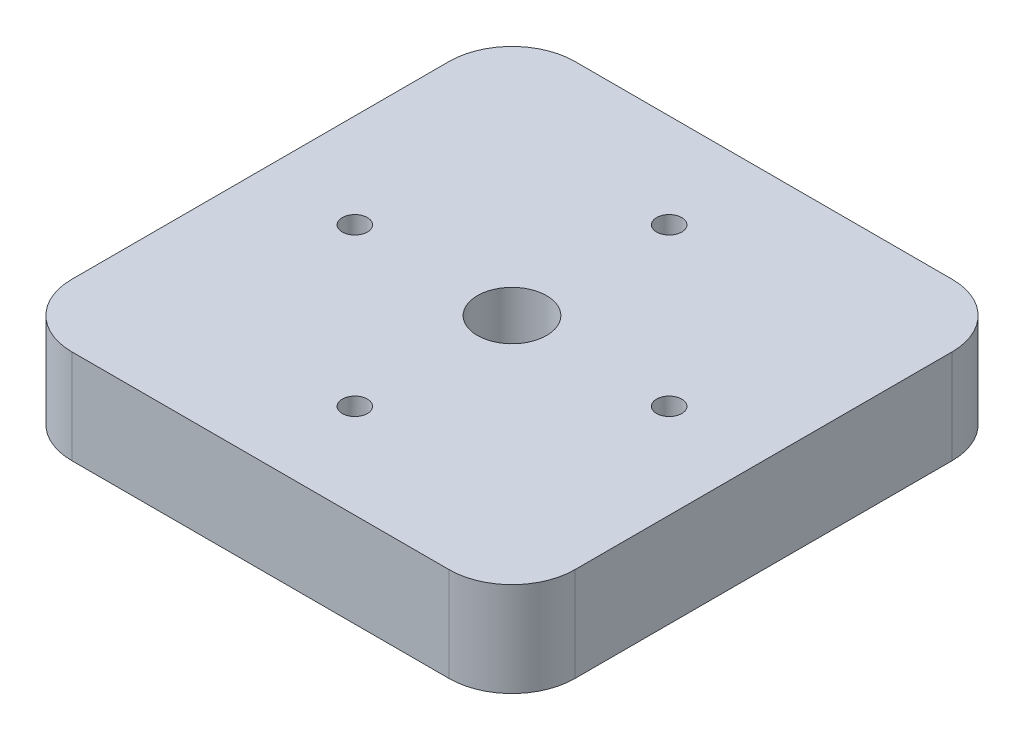
ISO-10303-21;
HEADER;
FILE_DESCRIPTION(('STEP AP214'),'2;1');
FILE_NAME('part.step','',(''),(''),'','','');
FILE_SCHEMA(('AUTOMOTIVE_DESIGN { 1 0 10303 214 1 1 1 1 }'));
ENDSEC;
DATA;
#1=APPLICATION_CONTEXT('core data for automotive mechanical design processes');
#2=APPLICATION_PROTOCOL_DEFINITION('international standard','automotive_design',2000,#1);
#3=PRODUCT_CONTEXT('',#1,'mechanical');
#4=PRODUCT('Part','Part','',(#3));
#5=PRODUCT_RELATED_PRODUCT_CATEGORY('part','',(#4));
#6=PRODUCT_DEFINITION_FORMATION('','',#4);
#7=PRODUCT_DEFINITION_CONTEXT('part definition',#1,'design');
#8=PRODUCT_DEFINITION('design','',#6,#7);
#9=PRODUCT_DEFINITION_SHAPE('','',#8);
#10=(LENGTH_UNIT() NAMED_UNIT(*) SI_UNIT(.MILLI.,.METRE.));
#11=(NAMED_UNIT(*) PLANE_ANGLE_UNIT() SI_UNIT($,.RADIAN.));
#12=(NAMED_UNIT(*) SI_UNIT($,.STERADIAN.) SOLID_ANGLE_UNIT());
#13=UNCERTAINTY_MEASURE_WITH_UNIT(LENGTH_MEASURE(1.E-05),#10,'distance_accuracy_value','');
#14=(GEOMETRIC_REPRESENTATION_CONTEXT(3) GLOBAL_UNCERTAINTY_ASSIGNED_CONTEXT((#13)) GLOBAL_UNIT_ASSIGNED_CONTEXT((#10,
#11,#12)) REPRESENTATION_CONTEXT('',''));
#15=CARTESIAN_POINT('',(0.,0.,0.));
#16=DIRECTION('',(0.,0.,1.));
#17=DIRECTION('',(1.,0.,0.));
#18=AXIS2_PLACEMENT_3D('',#15,#16,#17);
#19=CARTESIAN_POINT('',(0.,15.,0.));
#20=DIRECTION('',(0.,-1.,0.));
#21=DIRECTION('',(0.,0.,-1.));
#22=AXIS2_PLACEMENT_3D('',#19,#20,#21);
#23=CYLINDRICAL_SURFACE('',#22,7.);
#24=CARTESIAN_POINT('',(0.,0.,0.));
#25=DIRECTION('',(0.,1.,0.));
#26=DIRECTION('',(0.,0.,1.));
#27=AXIS2_PLACEMENT_3D('',#24,#25,#26);
#28=CIRCLE('',#27,7.);
#29=CARTESIAN_POINT('',(0.,0.,7.00000000000001));
#30=VERTEX_POINT('',#29);
#31=EDGE_CURVE('E147',#30,#30,#28,.T.);
#32=ORIENTED_EDGE('',*,*,#31,.F.);
#33=EDGE_LOOP('',(#32));
#34=FACE_BOUND('',#33,.T.);
#35=CARTESIAN_POINT('',(0.,7.,0.));
#36=DIRECTION('',(0.,1.,0.));
#37=DIRECTION('',(0.,0.,1.));
#38=AXIS2_PLACEMENT_3D('',#35,#36,#37);
#39=CIRCLE('',#38,7.);
#40=CARTESIAN_POINT('',(0.,7.,7.00000000000001));
#41=VERTEX_POINT('',#40);
#42=EDGE_CURVE('E242',#41,#41,#39,.T.);
#43=ORIENTED_EDGE('',*,*,#42,.T.);
#44=EDGE_LOOP('',(#43));
#45=FACE_BOUND('',#44,.T.);
#46=ADVANCED_FACE('F39',(#34,#45),#23,.F.);
#47=CARTESIAN_POINT('',(-30.,15.,30.));
#48=DIRECTION('',(0.,1.,0.));
#49=DIRECTION('',(0.,0.,1.));
#50=AXIS2_PLACEMENT_3D('',#47,#48,#49);
#51=PLANE('',#50);
#52=CARTESIAN_POINT('',(-25.,15.,0.));
#53=DIRECTION('',(0.,1.,0.));
#54=DIRECTION('',(0.,0.,1.));
#55=AXIS2_PLACEMENT_3D('',#52,#53,#54);
#56=CIRCLE('',#55,2.);
#57=CARTESIAN_POINT('',(-25.,15.,2.));
#58=VERTEX_POINT('',#57);
#59=EDGE_CURVE('E226',#58,#58,#56,.T.);
#60=ORIENTED_EDGE('',*,*,#59,.F.);
#61=EDGE_LOOP('',(#60));
#62=FACE_BOUND('',#61,.T.);
#63=CARTESIAN_POINT('',(0.,15.,-25.));
#64=DIRECTION('',(0.,1.,0.));
#65=DIRECTION('',(0.,0.,1.));
#66=AXIS2_PLACEMENT_3D('',#63,#64,#65);
#67=CIRCLE('',#66,2.);
#68=CARTESIAN_POINT('',(0.,15.,-23.));
#69=VERTEX_POINT('',#68);
#70=EDGE_CURVE('E213',#69,#69,#67,.T.);
#71=ORIENTED_EDGE('',*,*,#70,.F.);
#72=EDGE_LOOP('',(#71));
#73=FACE_BOUND('',#72,.T.);
#74=CARTESIAN_POINT('',(-30.,15.,30.));
#75=DIRECTION('',(0.,1.,0.));
#76=DIRECTION('',(0.,0.,1.));
#77=AXIS2_PLACEMENT_3D('',#74,#75,#76);
#78=CIRCLE('',#77,10.);
#79=CARTESIAN_POINT('',(-40.,15.,29.9999999999999));
#80=VERTEX_POINT('',#79);
#81=CARTESIAN_POINT('',(-29.9999999999999,15.,40.));
#82=VERTEX_POINT('',#81);
#83=EDGE_CURVE('E165',#80,#82,#78,.T.);
#84=ORIENTED_EDGE('',*,*,#83,.T.);
#85=DIRECTION('',(1.,0.,0.));
#86=VECTOR('',#85,1.);
#87=CARTESIAN_POINT('',(-29.9999999999999,15.,40.));
#88=LINE('',#87,#86);
#89=CARTESIAN_POINT('',(29.9999999999999,15.,40.));
#90=VERTEX_POINT('',#89);
#91=EDGE_CURVE('E100',#82,#90,#88,.T.);
#92=ORIENTED_EDGE('',*,*,#91,.T.);
#93=CARTESIAN_POINT('',(30.,15.,30.));
#94=DIRECTION('',(0.,1.,0.));
#95=DIRECTION('',(0.,0.,1.));
#96=AXIS2_PLACEMENT_3D('',#93,#94,#95);
#97=CIRCLE('',#96,10.);
#98=CARTESIAN_POINT('',(40.,15.,29.9999999999999));
#99=VERTEX_POINT('',#98);
#100=EDGE_CURVE('E186',#90,#99,#97,.T.);
#101=ORIENTED_EDGE('',*,*,#100,.T.);
#102=DIRECTION('',(0.,0.,-1.));
#103=VECTOR('',#102,1.);
#104=CARTESIAN_POINT('',(40.,15.,-29.9999999999999));
#105=LINE('',#104,#103);
#106=CARTESIAN_POINT('',(40.,15.,-29.9999999999999));
#107=VERTEX_POINT('',#106);
#108=EDGE_CURVE('E200',#99,#107,#105,.T.);
#109=ORIENTED_EDGE('',*,*,#108,.T.);
#110=CARTESIAN_POINT('',(30.,15.,-30.));
#111=DIRECTION('',(0.,1.,0.));
#112=DIRECTION('',(0.,0.,-1.));
#113=AXIS2_PLACEMENT_3D('',#110,#111,#112);
#114=CIRCLE('',#113,10.);
#115=CARTESIAN_POINT('',(29.9999999999999,15.,-40.));
#116=VERTEX_POINT('',#115);
#117=EDGE_CURVE('E120',#107,#116,#114,.T.);
#118=ORIENTED_EDGE('',*,*,#117,.T.);
#119=DIRECTION('',(-1.,0.,0.));
#120=VECTOR('',#119,1.);
#121=CARTESIAN_POINT('',(-29.9999999999999,15.,-40.));
#122=LINE('',#121,#120);
#123=CARTESIAN_POINT('',(-29.9999999999999,15.,-40.));
#124=VERTEX_POINT('',#123);
#125=EDGE_CURVE('E113',#116,#124,#122,.T.);
#126=ORIENTED_EDGE('',*,*,#125,.T.);
#127=CARTESIAN_POINT('',(-30.,15.,-30.));
#128=DIRECTION('',(0.,1.,0.));
#129=DIRECTION('',(0.,0.,1.));
#130=AXIS2_PLACEMENT_3D('',#127,#128,#129);
#131=CIRCLE('',#130,10.);
#132=CARTESIAN_POINT('',(-40.,15.,-29.9999999999999));
#133=VERTEX_POINT('',#132);
#134=EDGE_CURVE('E118',#124,#133,#131,.T.);
#135=ORIENTED_EDGE('',*,*,#134,.T.);
#136=DIRECTION('',(0.,0.,1.));
#137=VECTOR('',#136,1.);
#138=CARTESIAN_POINT('',(-40.,15.,-29.9999999999999));
#139=LINE('',#138,#137);
#140=EDGE_CURVE('E57',#133,#80,#139,.T.);
#141=ORIENTED_EDGE('',*,*,#140,.T.);
#142=EDGE_LOOP('',(#84,#92,#101,#109,#118,#126,#135,#141));
#143=FACE_BOUND('',#142,.T.);
#144=CARTESIAN_POINT('',(0.,15.,25.));
#145=DIRECTION('',(0.,1.,0.));
#146=DIRECTION('',(0.,0.,1.));
#147=AXIS2_PLACEMENT_3D('',#144,#145,#146);
#148=CIRCLE('',#147,2.);
#149=CARTESIAN_POINT('',(0.,15.,27.));
#150=VERTEX_POINT('',#149);
#151=EDGE_CURVE('E218',#150,#150,#148,.T.);
#152=ORIENTED_EDGE('',*,*,#151,.F.);
#153=EDGE_LOOP('',(#152));
#154=FACE_BOUND('',#153,.T.);
#155=CARTESIAN_POINT('',(25.,15.,0.));
#156=DIRECTION('',(0.,1.,0.));
#157=DIRECTION('',(0.,0.,1.));
#158=AXIS2_PLACEMENT_3D('',#155,#156,#157);
#159=CIRCLE('',#158,2.);
#160=CARTESIAN_POINT('',(25.,15.,2.00000000000001));
#161=VERTEX_POINT('',#160);
#162=EDGE_CURVE('E234',#161,#161,#159,.T.);
#163=ORIENTED_EDGE('',*,*,#162,.F.);
#164=EDGE_LOOP('',(#163));
#165=FACE_BOUND('',#164,.T.);
#166=CARTESIAN_POINT('',(0.,15.,0.));
#167=DIRECTION('',(0.,1.,0.));
#168=DIRECTION('',(0.,0.,1.));
#169=AXIS2_PLACEMENT_3D('',#166,#167,#168);
#170=CIRCLE('',#169,5.5);
#171=CARTESIAN_POINT('',(0.,15.,5.50000000000001));
#172=VERTEX_POINT('',#171);
#173=EDGE_CURVE('E250',#172,#172,#170,.T.);
#174=ORIENTED_EDGE('',*,*,#173,.F.);
#175=EDGE_LOOP('',(#174));
#176=FACE_BOUND('',#175,.T.);
#177=ADVANCED_FACE('F115',(#62,#73,#143,#154,#165,#176),#51,.T.);
#178=CARTESIAN_POINT('',(-30.,0.,30.));
#179=DIRECTION('',(0.,1.,0.));
#180=DIRECTION('',(0.,0.,1.));
#181=AXIS2_PLACEMENT_3D('',#178,#179,#180);
#182=PLANE('',#181);
#183=CARTESIAN_POINT('',(-30.,0.,30.));
#184=DIRECTION('',(0.,1.,0.));
#185=DIRECTION('',(0.,0.,1.));
#186=AXIS2_PLACEMENT_3D('',#183,#184,#185);
#187=CIRCLE('',#186,10.);
#188=CARTESIAN_POINT('',(-40.,0.,29.9999999999999));
#189=VERTEX_POINT('',#188);
#190=CARTESIAN_POINT('',(-29.9999999999999,0.,40.));
#191=VERTEX_POINT('',#190);
#192=EDGE_CURVE('E142',#189,#191,#187,.T.);
#193=ORIENTED_EDGE('',*,*,#192,.F.);
#194=DIRECTION('',(0.,0.,1.));
#195=VECTOR('',#194,1.);
#196=CARTESIAN_POINT('',(-40.,0.,-29.9999999999999));
#197=LINE('',#196,#195);
#198=CARTESIAN_POINT('',(-40.,0.,-29.9999999999999));
#199=VERTEX_POINT('',#198);
#200=EDGE_CURVE('E92',#199,#189,#197,.T.);
#201=ORIENTED_EDGE('',*,*,#200,.F.);
#202=CARTESIAN_POINT('',(-30.,0.,-30.));
#203=DIRECTION('',(0.,1.,0.));
#204=DIRECTION('',(0.,0.,1.));
#205=AXIS2_PLACEMENT_3D('',#202,#203,#204);
#206=CIRCLE('',#205,10.);
#207=CARTESIAN_POINT('',(-29.9999999999999,0.,-40.));
#208=VERTEX_POINT('',#207);
#209=EDGE_CURVE('E86',#208,#199,#206,.T.);
#210=ORIENTED_EDGE('',*,*,#209,.F.);
#211=DIRECTION('',(-1.,0.,0.));
#212=VECTOR('',#211,1.);
#213=CARTESIAN_POINT('',(-29.9999999999999,0.,-40.));
#214=LINE('',#213,#212);
#215=CARTESIAN_POINT('',(29.9999999999999,0.,-40.));
#216=VERTEX_POINT('',#215);
#217=EDGE_CURVE('E129',#216,#208,#214,.T.);
#218=ORIENTED_EDGE('',*,*,#217,.F.);
#219=CARTESIAN_POINT('',(30.,0.,-30.));
#220=DIRECTION('',(0.,1.,0.));
#221=DIRECTION('',(0.,0.,-1.));
#222=AXIS2_PLACEMENT_3D('',#219,#220,#221);
#223=CIRCLE('',#222,10.);
#224=CARTESIAN_POINT('',(40.,0.,-29.9999999999999));
#225=VERTEX_POINT('',#224);
#226=EDGE_CURVE('E156',#225,#216,#223,.T.);
#227=ORIENTED_EDGE('',*,*,#226,.F.);
#228=DIRECTION('',(0.,0.,-1.));
#229=VECTOR('',#228,1.);
#230=CARTESIAN_POINT('',(40.,0.,-29.9999999999999));
#231=LINE('',#230,#229);
#232=CARTESIAN_POINT('',(40.,0.,29.9999999999999));
#233=VERTEX_POINT('',#232);
#234=EDGE_CURVE('E153',#233,#225,#231,.T.);
#235=ORIENTED_EDGE('',*,*,#234,.F.);
#236=CARTESIAN_POINT('',(30.,0.,30.));
#237=DIRECTION('',(0.,1.,0.));
#238=DIRECTION('',(0.,0.,1.));
#239=AXIS2_PLACEMENT_3D('',#236,#237,#238);
#240=CIRCLE('',#239,10.);
#241=CARTESIAN_POINT('',(29.9999999999999,0.,40.));
#242=VERTEX_POINT('',#241);
#243=EDGE_CURVE('E150',#242,#233,#240,.T.);
#244=ORIENTED_EDGE('',*,*,#243,.F.);
#245=DIRECTION('',(1.,0.,0.));
#246=VECTOR('',#245,1.);
#247=CARTESIAN_POINT('',(-29.9999999999999,0.,40.));
#248=LINE('',#247,#246);
#249=EDGE_CURVE('E146',#191,#242,#248,.T.);
#250=ORIENTED_EDGE('',*,*,#249,.F.);
#251=EDGE_LOOP('',(#193,#201,#210,#218,#227,#235,#244,#250));
#252=FACE_BOUND('',#251,.T.);
#253=ORIENTED_EDGE('',*,*,#31,.T.);
#254=EDGE_LOOP('',(#253));
#255=FACE_BOUND('',#254,.T.);
#256=CARTESIAN_POINT('',(0.,0.,-25.));
#257=DIRECTION('',(0.,1.,0.));
#258=DIRECTION('',(0.,0.,1.));
#259=AXIS2_PLACEMENT_3D('',#256,#257,#258);
#260=CIRCLE('',#259,2.);
#261=CARTESIAN_POINT('',(0.,0.,-23.));
#262=VERTEX_POINT('',#261);
#263=EDGE_CURVE('E214',#262,#262,#260,.T.);
#264=ORIENTED_EDGE('',*,*,#263,.T.);
#265=EDGE_LOOP('',(#264));
#266=FACE_BOUND('',#265,.T.);
#267=CARTESIAN_POINT('',(0.,0.,25.));
#268=DIRECTION('',(0.,1.,0.));
#269=DIRECTION('',(0.,0.,1.));
#270=AXIS2_PLACEMENT_3D('',#267,#268,#269);
#271=CIRCLE('',#270,2.);
#272=CARTESIAN_POINT('',(0.,0.,27.));
#273=VERTEX_POINT('',#272);
#274=EDGE_CURVE('E222',#273,#273,#271,.T.);
#275=ORIENTED_EDGE('',*,*,#274,.T.);
#276=EDGE_LOOP('',(#275));
#277=FACE_BOUND('',#276,.T.);
#278=CARTESIAN_POINT('',(-25.,0.,0.));
#279=DIRECTION('',(0.,1.,0.));
#280=DIRECTION('',(0.,0.,1.));
#281=AXIS2_PLACEMENT_3D('',#278,#279,#280);
#282=CIRCLE('',#281,2.);
#283=CARTESIAN_POINT('',(-25.,0.,2.));
#284=VERTEX_POINT('',#283);
#285=EDGE_CURVE('E230',#284,#284,#282,.T.);
#286=ORIENTED_EDGE('',*,*,#285,.T.);
#287=EDGE_LOOP('',(#286));
#288=FACE_BOUND('',#287,.T.);
#289=CARTESIAN_POINT('',(25.,0.,0.));
#290=DIRECTION('',(0.,1.,0.));
#291=DIRECTION('',(0.,0.,1.));
#292=AXIS2_PLACEMENT_3D('',#289,#290,#291);
#293=CIRCLE('',#292,2.);
#294=CARTESIAN_POINT('',(25.,0.,2.00000000000001));
#295=VERTEX_POINT('',#294);
#296=EDGE_CURVE('E238',#295,#295,#293,.T.);
#297=ORIENTED_EDGE('',*,*,#296,.T.);
#298=EDGE_LOOP('',(#297));
#299=FACE_BOUND('',#298,.T.);
#300=ADVANCED_FACE('F190',(#252,#255,#266,#277,#288,#299),#182,.F.);
#301=CARTESIAN_POINT('',(-30.,15.,30.));
#302=DIRECTION('',(0.,-1.,0.));
#303=DIRECTION('',(0.,0.,-1.));
#304=AXIS2_PLACEMENT_3D('',#301,#302,#303);
#305=CYLINDRICAL_SURFACE('',#304,10.);
#306=ORIENTED_EDGE('',*,*,#192,.T.);
#307=DIRECTION('',(0.,-1.,0.));
#308=VECTOR('',#307,1.);
#309=CARTESIAN_POINT('',(-29.9999999999999,15.,40.));
#310=LINE('',#309,#308);
#311=EDGE_CURVE('E11',#82,#191,#310,.T.);
#312=ORIENTED_EDGE('',*,*,#311,.F.);
#313=ORIENTED_EDGE('',*,*,#83,.F.);
#314=DIRECTION('',(0.,-1.,0.));
#315=VECTOR('',#314,1.);
#316=CARTESIAN_POINT('',(-40.,15.,29.9999999999999));
#317=LINE('',#316,#315);
#318=EDGE_CURVE('E138',#80,#189,#317,.T.);
#319=ORIENTED_EDGE('',*,*,#318,.T.);
#320=EDGE_LOOP('',(#306,#312,#313,#319));
#321=FACE_BOUND('',#320,.T.);
#322=ADVANCED_FACE('F41',(#321),#305,.T.);
#323=CARTESIAN_POINT('',(-29.9999999999999,15.,40.));
#324=DIRECTION('',(0.,0.,-1.));
#325=DIRECTION('',(-1.,0.,0.));
#326=AXIS2_PLACEMENT_3D('',#323,#324,#325);
#327=PLANE('',#326);
#328=ORIENTED_EDGE('',*,*,#249,.T.);
#329=DIRECTION('',(0.,-1.,0.));
#330=VECTOR('',#329,1.);
#331=CARTESIAN_POINT('',(29.9999999999999,15.,40.));
#332=LINE('',#331,#330);
#333=EDGE_CURVE('E49',#90,#242,#332,.T.);
#334=ORIENTED_EDGE('',*,*,#333,.F.);
#335=ORIENTED_EDGE('',*,*,#91,.F.);
#336=ORIENTED_EDGE('',*,*,#311,.T.);
#337=EDGE_LOOP('',(#328,#334,#335,#336));
#338=FACE_BOUND('',#337,.T.);
#339=ADVANCED_FACE('F294',(#338),#327,.F.);
#340=CARTESIAN_POINT('',(30.,15.,30.));
#341=DIRECTION('',(0.,-1.,0.));
#342=DIRECTION('',(0.,0.,-1.));
#343=AXIS2_PLACEMENT_3D('',#340,#341,#342);
#344=CYLINDRICAL_SURFACE('',#343,10.);
#345=ORIENTED_EDGE('',*,*,#243,.T.);
#346=DIRECTION('',(0.,-1.,0.));
#347=VECTOR('',#346,1.);
#348=CARTESIAN_POINT('',(40.,15.,29.9999999999999));
#349=LINE('',#348,#347);
#350=EDGE_CURVE('E176',#99,#233,#349,.T.);
#351=ORIENTED_EDGE('',*,*,#350,.F.);
#352=ORIENTED_EDGE('',*,*,#100,.F.);
#353=ORIENTED_EDGE('',*,*,#333,.T.);
#354=EDGE_LOOP('',(#345,#351,#352,#353));
#355=FACE_BOUND('',#354,.T.);
#356=ADVANCED_FACE('F184',(#355),#344,.T.);
#357=CARTESIAN_POINT('',(40.,15.,-29.9999999999999));
#358=DIRECTION('',(-1.,0.,0.));
#359=DIRECTION('',(0.,0.,1.));
#360=AXIS2_PLACEMENT_3D('',#357,#358,#359);
#361=PLANE('',#360);
#362=ORIENTED_EDGE('',*,*,#234,.T.);
#363=DIRECTION('',(0.,-1.,0.));
#364=VECTOR('',#363,1.);
#365=CARTESIAN_POINT('',(40.,15.,-29.9999999999999));
#366=LINE('',#365,#364);
#367=EDGE_CURVE('E172',#107,#225,#366,.T.);
#368=ORIENTED_EDGE('',*,*,#367,.F.);
#369=ORIENTED_EDGE('',*,*,#108,.F.);
#370=ORIENTED_EDGE('',*,*,#350,.T.);
#371=EDGE_LOOP('',(#362,#368,#369,#370));
#372=FACE_BOUND('',#371,.T.);
#373=ADVANCED_FACE('F195',(#372),#361,.F.);
#374=CARTESIAN_POINT('',(30.,15.,-30.));
#375=DIRECTION('',(0.,-1.,0.));
#376=DIRECTION('',(0.,0.,-1.));
#377=AXIS2_PLACEMENT_3D('',#374,#375,#376);
#378=CYLINDRICAL_SURFACE('',#377,10.);
#379=ORIENTED_EDGE('',*,*,#226,.T.);
#380=DIRECTION('',(0.,-1.,0.));
#381=VECTOR('',#380,1.);
#382=CARTESIAN_POINT('',(29.9999999999999,15.,-40.));
#383=LINE('',#382,#381);
#384=EDGE_CURVE('E131',#116,#216,#383,.T.);
#385=ORIENTED_EDGE('',*,*,#384,.F.);
#386=ORIENTED_EDGE('',*,*,#117,.F.);
#387=ORIENTED_EDGE('',*,*,#367,.T.);
#388=EDGE_LOOP('',(#379,#385,#386,#387));
#389=FACE_BOUND('',#388,.T.);
#390=ADVANCED_FACE('F198',(#389),#378,.T.);
#391=CARTESIAN_POINT('',(-29.9999999999999,15.,-40.));
#392=DIRECTION('',(0.,0.,1.));
#393=DIRECTION('',(1.,0.,0.));
#394=AXIS2_PLACEMENT_3D('',#391,#392,#393);
#395=PLANE('',#394);
#396=ORIENTED_EDGE('',*,*,#217,.T.);
#397=DIRECTION('',(0.,-1.,0.));
#398=VECTOR('',#397,1.);
#399=CARTESIAN_POINT('',(-29.9999999999999,15.,-40.));
#400=LINE('',#399,#398);
#401=EDGE_CURVE('E126',#124,#208,#400,.T.);
#402=ORIENTED_EDGE('',*,*,#401,.F.);
#403=ORIENTED_EDGE('',*,*,#125,.F.);
#404=ORIENTED_EDGE('',*,*,#384,.T.);
#405=EDGE_LOOP('',(#396,#402,#403,#404));
#406=FACE_BOUND('',#405,.T.);
#407=ADVANCED_FACE('F127',(#406),#395,.F.);
#408=CARTESIAN_POINT('',(-30.,15.,-30.));
#409=DIRECTION('',(0.,-1.,0.));
#410=DIRECTION('',(0.,0.,-1.));
#411=AXIS2_PLACEMENT_3D('',#408,#409,#410);
#412=CYLINDRICAL_SURFACE('',#411,10.);
#413=ORIENTED_EDGE('',*,*,#209,.T.);
#414=DIRECTION('',(0.,-1.,0.));
#415=VECTOR('',#414,1.);
#416=CARTESIAN_POINT('',(-40.,15.,-29.9999999999999));
#417=LINE('',#416,#415);
#418=EDGE_CURVE('E132',#133,#199,#417,.T.);
#419=ORIENTED_EDGE('',*,*,#418,.F.);
#420=ORIENTED_EDGE('',*,*,#134,.F.);
#421=ORIENTED_EDGE('',*,*,#401,.T.);
#422=EDGE_LOOP('',(#413,#419,#420,#421));
#423=FACE_BOUND('',#422,.T.);
#424=ADVANCED_FACE('F134',(#423),#412,.T.);
#425=CARTESIAN_POINT('',(-40.,15.,-29.9999999999999));
#426=DIRECTION('',(1.,0.,0.));
#427=DIRECTION('',(0.,0.,-1.));
#428=AXIS2_PLACEMENT_3D('',#425,#426,#427);
#429=PLANE('',#428);
#430=ORIENTED_EDGE('',*,*,#200,.T.);
#431=ORIENTED_EDGE('',*,*,#318,.F.);
#432=ORIENTED_EDGE('',*,*,#140,.F.);
#433=ORIENTED_EDGE('',*,*,#418,.T.);
#434=EDGE_LOOP('',(#430,#431,#432,#433));
#435=FACE_BOUND('',#434,.T.);
#436=ADVANCED_FACE('F281',(#435),#429,.F.);
#437=CARTESIAN_POINT('',(0.,15.,-25.));
#438=DIRECTION('',(0.,-1.,0.));
#439=DIRECTION('',(0.,0.,-1.));
#440=AXIS2_PLACEMENT_3D('',#437,#438,#439);
#441=CYLINDRICAL_SURFACE('',#440,2.);
#442=ORIENTED_EDGE('',*,*,#70,.T.);
#443=EDGE_LOOP('',(#442));
#444=FACE_BOUND('',#443,.T.);
#445=ORIENTED_EDGE('',*,*,#263,.F.);
#446=EDGE_LOOP('',(#445));
#447=FACE_BOUND('',#446,.T.);
#448=ADVANCED_FACE('F284',(#444,#447),#441,.F.);
#449=CARTESIAN_POINT('',(0.,15.,25.));
#450=DIRECTION('',(0.,-1.,0.));
#451=DIRECTION('',(0.,0.,-1.));
#452=AXIS2_PLACEMENT_3D('',#449,#450,#451);
#453=CYLINDRICAL_SURFACE('',#452,2.);
#454=ORIENTED_EDGE('',*,*,#151,.T.);
#455=EDGE_LOOP('',(#454));
#456=FACE_BOUND('',#455,.T.);
#457=ORIENTED_EDGE('',*,*,#274,.F.);
#458=EDGE_LOOP('',(#457));
#459=FACE_BOUND('',#458,.T.);
#460=ADVANCED_FACE('F358',(#456,#459),#453,.F.);
#461=CARTESIAN_POINT('',(-25.,15.,0.));
#462=DIRECTION('',(0.,-1.,0.));
#463=DIRECTION('',(0.,0.,-1.));
#464=AXIS2_PLACEMENT_3D('',#461,#462,#463);
#465=CYLINDRICAL_SURFACE('',#464,2.);
#466=ORIENTED_EDGE('',*,*,#59,.T.);
#467=EDGE_LOOP('',(#466));
#468=FACE_BOUND('',#467,.T.);
#469=ORIENTED_EDGE('',*,*,#285,.F.);
#470=EDGE_LOOP('',(#469));
#471=FACE_BOUND('',#470,.T.);
#472=ADVANCED_FACE('F366',(#468,#471),#465,.F.);
#473=CARTESIAN_POINT('',(25.,15.,0.));
#474=DIRECTION('',(0.,-1.,0.));
#475=DIRECTION('',(0.,0.,-1.));
#476=AXIS2_PLACEMENT_3D('',#473,#474,#475);
#477=CYLINDRICAL_SURFACE('',#476,2.);
#478=ORIENTED_EDGE('',*,*,#162,.T.);
#479=EDGE_LOOP('',(#478));
#480=FACE_BOUND('',#479,.T.);
#481=ORIENTED_EDGE('',*,*,#296,.F.);
#482=EDGE_LOOP('',(#481));
#483=FACE_BOUND('',#482,.T.);
#484=ADVANCED_FACE('F375',(#480,#483),#477,.F.);
#485=CARTESIAN_POINT('',(0.,7.,0.));
#486=DIRECTION('',(0.,1.,0.));
#487=DIRECTION('',(0.,0.,1.));
#488=AXIS2_PLACEMENT_3D('',#485,#486,#487);
#489=PLANE('',#488);
#490=CARTESIAN_POINT('',(0.,7.,0.));
#491=DIRECTION('',(0.,1.,0.));
#492=DIRECTION('',(0.,0.,1.));
#493=AXIS2_PLACEMENT_3D('',#490,#491,#492);
#494=CIRCLE('',#493,5.5);
#495=CARTESIAN_POINT('',(0.,7.,5.50000000000001));
#496=VERTEX_POINT('',#495);
#497=EDGE_CURVE('E249',#496,#496,#494,.T.);
#498=ORIENTED_EDGE('',*,*,#497,.T.);
#499=EDGE_LOOP('',(#498));
#500=FACE_BOUND('',#499,.T.);
#501=ORIENTED_EDGE('',*,*,#42,.F.);
#502=EDGE_LOOP('',(#501));
#503=FACE_BOUND('',#502,.T.);
#504=ADVANCED_FACE('F258',(#500,#503),#489,.F.);
#505=CARTESIAN_POINT('',(0.,7.,0.));
#506=DIRECTION('',(0.,1.,0.));
#507=DIRECTION('',(0.,0.,1.));
#508=AXIS2_PLACEMENT_3D('',#505,#506,#507);
#509=CYLINDRICAL_SURFACE('',#508,5.5);
#510=ORIENTED_EDGE('',*,*,#497,.F.);
#511=EDGE_LOOP('',(#510));
#512=FACE_BOUND('',#511,.T.);
#513=ORIENTED_EDGE('',*,*,#173,.T.);
#514=EDGE_LOOP('',(#513));
#515=FACE_BOUND('',#514,.T.);
#516=ADVANCED_FACE('F261',(#512,#515),#509,.F.);
#517=CLOSED_SHELL('',(#46,#177,#300,#322,#339,#356,#373,#390,#407,#424,#436,#448,#460,#472,#484,
#504,#516));
#518=MANIFOLD_SOLID_BREP('B2',#517);
#519=ADVANCED_BREP_SHAPE_REPRESENTATION('',(#18,#518),#14);
#520=SHAPE_DEFINITION_REPRESENTATION(#9,#519);
ENDSEC;
END-ISO-10303-21;
